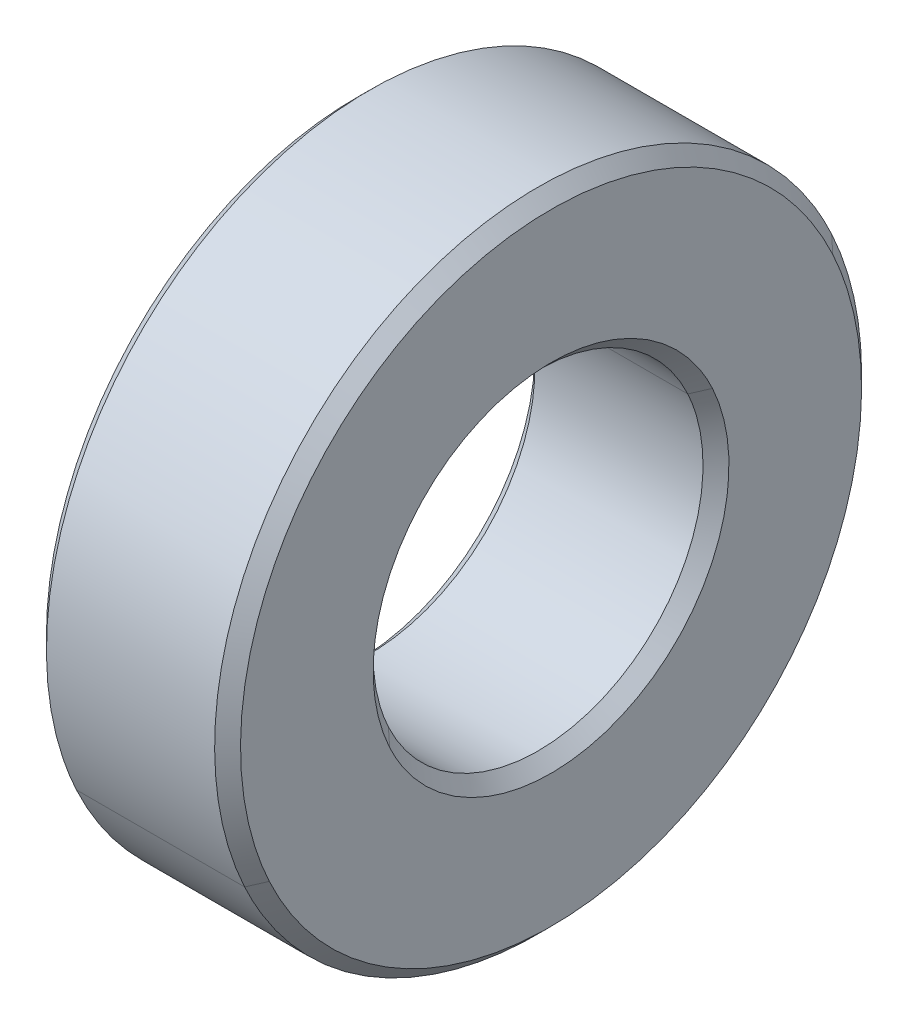
ISO-10303-21;
HEADER;
FILE_DESCRIPTION(('STEP AP214'),'2;1');
FILE_NAME('part.step','',(''),(''),'','','');
FILE_SCHEMA(('AUTOMOTIVE_DESIGN { 1 0 10303 214 1 1 1 1 }'));
ENDSEC;
DATA;
#1=APPLICATION_CONTEXT('core data for automotive mechanical design processes');
#2=APPLICATION_PROTOCOL_DEFINITION('international standard','automotive_design',2000,#1);
#3=PRODUCT_CONTEXT('',#1,'mechanical');
#4=PRODUCT('Part','Part','',(#3));
#5=PRODUCT_RELATED_PRODUCT_CATEGORY('part','',(#4));
#6=PRODUCT_DEFINITION_FORMATION('','',#4);
#7=PRODUCT_DEFINITION_CONTEXT('part definition',#1,'design');
#8=PRODUCT_DEFINITION('design','',#6,#7);
#9=PRODUCT_DEFINITION_SHAPE('','',#8);
#10=(LENGTH_UNIT() NAMED_UNIT(*) SI_UNIT(.MILLI.,.METRE.));
#11=(NAMED_UNIT(*) PLANE_ANGLE_UNIT() SI_UNIT($,.RADIAN.));
#12=(NAMED_UNIT(*) SI_UNIT($,.STERADIAN.) SOLID_ANGLE_UNIT());
#13=UNCERTAINTY_MEASURE_WITH_UNIT(LENGTH_MEASURE(1.E-05),#10,'distance_accuracy_value','');
#14=(GEOMETRIC_REPRESENTATION_CONTEXT(3) GLOBAL_UNCERTAINTY_ASSIGNED_CONTEXT((#13)) GLOBAL_UNIT_ASSIGNED_CONTEXT((#10,
#11,#12)) REPRESENTATION_CONTEXT('',''));
#15=CARTESIAN_POINT('',(0.,0.,0.));
#16=DIRECTION('',(0.,0.,1.));
#17=DIRECTION('',(1.,0.,0.));
#18=AXIS2_PLACEMENT_3D('',#15,#16,#17);
#19=CARTESIAN_POINT('',(179.365281719252,-135.419588338646,254.236344584318));
#20=CARTESIAN_POINT('',(179.565281719252,-135.503685232968,254.417804531319));
#21=CARTESIAN_POINT('',(179.365281719252,-139.774627066664,252.218019120607));
#22=CARTESIAN_POINT('',(179.565281719252,-140.040183907986,252.315382173286));
#23=CARTESIAN_POINT('',(179.365281719252,-137.756301602952,247.862980392589));
#24=CARTESIAN_POINT('',(179.565281719252,-137.937761549952,247.778883498268));
#25=CARTESIAN_POINT('',(179.365281719252,-135.73797613924,243.507941664572));
#26=CARTESIAN_POINT('',(179.565281719252,-135.835339191919,243.242384823249));
#27=CARTESIAN_POINT('',(179.365281719252,-131.382937411222,245.526267128284));
#28=CARTESIAN_POINT('',(179.565281719252,-131.298840516901,245.344807181283));
#29=(BOUNDED_SURFACE() B_SPLINE_SURFACE(2,1,((#19,#20),(#21,#22),(#23,#24),(#25,#26),(#27,#28)),
.UNSPECIFIED.,.F.,.F.,.F.) B_SPLINE_SURFACE_WITH_KNOTS((3,2,3),(2,2),(1.57079632679488,
3.14159265358979,4.71238898038471),(0.,0.282842712474616),
.UNSPECIFIED.) GEOMETRIC_REPRESENTATION_ITEM() RATIONAL_B_SPLINE_SURFACE(((1.,1.),
(0.707106781186541,0.707106781186541),(1.,1.),(0.707106781186541,0.707106781186541),(1.,1.))) REPRESENTATION_ITEM('') SURFACE());
#30=CARTESIAN_POINT('',(179.365281719252,-131.382937411222,245.526267128284));
#31=CARTESIAN_POINT('',(179.565281719252,-131.298840516901,245.344807181283));
#32=(BOUNDED_CURVE() B_SPLINE_CURVE(1,(#30,#31),.UNSPECIFIED.,.F.,
.F.) B_SPLINE_CURVE_WITH_KNOTS((2,2),(0.,0.282842712474606),
.UNSPECIFIED.) CURVE() GEOMETRIC_REPRESENTATION_ITEM() RATIONAL_B_SPLINE_CURVE((1.,1.)) REPRESENTATION_ITEM(''));
#33=CARTESIAN_POINT('',(179.365281719252,-131.382937411222,245.526267128284));
#34=VERTEX_POINT('',#33);
#35=CARTESIAN_POINT('',(179.565281719252,-131.298840516901,245.344807181283));
#36=VERTEX_POINT('',#35);
#37=EDGE_CURVE('E291',#34,#36,#32,.T.);
#38=CARTESIAN_POINT('',(179.565281719252,-135.503685232968,254.417804531319));
#39=CARTESIAN_POINT('',(179.565281719252,-140.040183907986,252.315382173286));
#40=CARTESIAN_POINT('',(179.565281719252,-137.937761549952,247.778883498268));
#41=CARTESIAN_POINT('',(179.565281719252,-135.835339191919,243.24238482325));
#42=CARTESIAN_POINT('',(179.565281719252,-131.298840516901,245.344807181283));
#43=(BOUNDED_CURVE() B_SPLINE_CURVE(2,(#38,#39,#40,#41,#42),.UNSPECIFIED.,.F.,
.F.) B_SPLINE_CURVE_WITH_KNOTS((3,2,3),(0.,7.85398163397448,15.707963267949),
.UNSPECIFIED.) CURVE() GEOMETRIC_REPRESENTATION_ITEM() RATIONAL_B_SPLINE_CURVE((1.,
0.707106781186548,1.,0.707106781186548,1.)) REPRESENTATION_ITEM(''));
#44=CARTESIAN_POINT('',(179.565281719252,-135.503685232968,254.417804531319));
#45=VERTEX_POINT('',#44);
#46=EDGE_CURVE('E132',#45,#36,#43,.T.);
#47=CARTESIAN_POINT('',(179.365281719252,-135.419588338646,254.236344584318));
#48=CARTESIAN_POINT('',(179.565281719252,-135.503685232968,254.417804531319));
#49=(BOUNDED_CURVE() B_SPLINE_CURVE(1,(#47,#48),.UNSPECIFIED.,.F.,
.F.) B_SPLINE_CURVE_WITH_KNOTS((2,2),(0.,0.282842712474606),
.UNSPECIFIED.) CURVE() GEOMETRIC_REPRESENTATION_ITEM() RATIONAL_B_SPLINE_CURVE((1.,1.)) REPRESENTATION_ITEM(''));
#50=CARTESIAN_POINT('',(179.365281719252,-135.419588338646,254.236344584318));
#51=VERTEX_POINT('',#50);
#52=EDGE_CURVE('E133',#51,#45,#49,.T.);
#53=CARTESIAN_POINT('',(179.365281719252,-131.382937411222,245.526267128284));
#54=CARTESIAN_POINT('',(179.365281719252,-135.73797613924,243.507941664572));
#55=CARTESIAN_POINT('',(179.365281719252,-137.756301602952,247.862980392589));
#56=CARTESIAN_POINT('',(179.365281719252,-139.774627066664,252.218019120606));
#57=CARTESIAN_POINT('',(179.365281719252,-135.419588338646,254.236344584318));
#58=(BOUNDED_CURVE() B_SPLINE_CURVE(2,(#53,#54,#55,#56,#57),.UNSPECIFIED.,.F.,
.F.) B_SPLINE_CURVE_WITH_KNOTS((3,2,3),(0.,7.53982236861551,15.079644737231),
.UNSPECIFIED.) CURVE() GEOMETRIC_REPRESENTATION_ITEM() RATIONAL_B_SPLINE_CURVE((1.,
0.707106781186548,1.,0.707106781186548,1.)) REPRESENTATION_ITEM(''));
#59=EDGE_CURVE('E389',#34,#51,#58,.T.);
#60=ORIENTED_EDGE('',*,*,#37,.T.);
#61=ORIENTED_EDGE('',*,*,#46,.F.);
#62=ORIENTED_EDGE('',*,*,#52,.F.);
#63=ORIENTED_EDGE('',*,*,#59,.F.);
#64=EDGE_LOOP('',(#60,#61,#62,#63));
#65=FACE_BOUND('',#64,.T.);
#66=ADVANCED_FACE('F51',(#65),#29,.T.);
#67=CARTESIAN_POINT('',(179.565281719252,-132.329027472337,247.567691532042));
#68=CARTESIAN_POINT('',(179.565281719252,-134.642641796597,246.495456129445));
#69=CARTESIAN_POINT('',(179.565281719252,-135.714877199194,248.809070453704));
#70=CARTESIAN_POINT('',(179.565281719252,-136.787112601791,251.122684777963));
#71=CARTESIAN_POINT('',(179.565281719252,-134.473498277531,252.19492018056));
#72=CARTESIAN_POINT('',(179.365281719252,-132.244930578016,247.386231585041));
#73=CARTESIAN_POINT('',(179.365281719252,-134.740004849276,246.229899288123));
#74=CARTESIAN_POINT('',(179.365281719252,-135.896337146194,248.724973559383));
#75=CARTESIAN_POINT('',(179.365281719252,-137.052669443113,251.220047830643));
#76=CARTESIAN_POINT('',(179.365281719252,-134.557595171853,252.376380127561));
#77=(BOUNDED_SURFACE() B_SPLINE_SURFACE(1,2,((#67,#68,#69,#70,#71),(#72,#73,#74,#75,#76)),
.UNSPECIFIED.,.F.,.F.,.F.) B_SPLINE_SURFACE_WITH_KNOTS((2,2),(3,2,3),(0.,0.282842712474617),
(1.5707963267949,3.14159265358979,4.71238898038469),
.UNSPECIFIED.) GEOMETRIC_REPRESENTATION_ITEM() RATIONAL_B_SPLINE_SURFACE(((1.,0.707106781186548,
1.,0.707106781186548,1.),(1.,0.707106781186548,1.,0.707106781186548,1.))) REPRESENTATION_ITEM('') SURFACE());
#78=CARTESIAN_POINT('',(179.565281719252,-134.473498277531,252.19492018056));
#79=CARTESIAN_POINT('',(179.365281719252,-134.557595171853,252.376380127561));
#80=(BOUNDED_CURVE() B_SPLINE_CURVE(1,(#78,#79),.UNSPECIFIED.,.F.,
.F.) B_SPLINE_CURVE_WITH_KNOTS((2,2),(0.,0.282842712474606),
.UNSPECIFIED.) CURVE() GEOMETRIC_REPRESENTATION_ITEM() RATIONAL_B_SPLINE_CURVE((1.,1.)) REPRESENTATION_ITEM(''));
#81=CARTESIAN_POINT('',(179.565281719252,-134.473498277531,252.19492018056));
#82=VERTEX_POINT('',#81);
#83=CARTESIAN_POINT('',(179.365281719252,-134.557595171853,252.376380127561));
#84=VERTEX_POINT('',#83);
#85=EDGE_CURVE('E217',#82,#84,#80,.T.);
#86=CARTESIAN_POINT('',(179.565281719252,-132.329027472337,247.567691532042));
#87=CARTESIAN_POINT('',(179.565281719252,-134.642641796597,246.495456129445));
#88=CARTESIAN_POINT('',(179.565281719252,-135.714877199194,248.809070453704));
#89=CARTESIAN_POINT('',(179.565281719252,-136.787112601791,251.122684777963));
#90=CARTESIAN_POINT('',(179.565281719252,-134.473498277531,252.19492018056));
#91=(BOUNDED_CURVE() B_SPLINE_CURVE(2,(#86,#87,#88,#89,#90),.UNSPECIFIED.,.F.,
.F.) B_SPLINE_CURVE_WITH_KNOTS((3,2,3),(0.,4.00553063332698,8.01106126665397),
.UNSPECIFIED.) CURVE() GEOMETRIC_REPRESENTATION_ITEM() RATIONAL_B_SPLINE_CURVE((1.,
0.707106781186548,1.,0.707106781186548,1.)) REPRESENTATION_ITEM(''));
#92=CARTESIAN_POINT('',(179.565281719252,-132.329027472337,247.567691532042));
#93=VERTEX_POINT('',#92);
#94=EDGE_CURVE('E65',#93,#82,#91,.T.);
#95=CARTESIAN_POINT('',(179.565281719252,-132.329027472337,247.567691532042));
#96=CARTESIAN_POINT('',(179.365281719252,-132.244930578016,247.386231585041));
#97=(BOUNDED_CURVE() B_SPLINE_CURVE(1,(#95,#96),.UNSPECIFIED.,.F.,
.F.) B_SPLINE_CURVE_WITH_KNOTS((2,2),(0.,0.282842712474606),
.UNSPECIFIED.) CURVE() GEOMETRIC_REPRESENTATION_ITEM() RATIONAL_B_SPLINE_CURVE((1.,1.)) REPRESENTATION_ITEM(''));
#98=CARTESIAN_POINT('',(179.365281719252,-132.244930578016,247.386231585041));
#99=VERTEX_POINT('',#98);
#100=EDGE_CURVE('E283',#93,#99,#97,.T.);
#101=CARTESIAN_POINT('',(179.365281719252,-134.557595171853,252.376380127561));
#102=CARTESIAN_POINT('',(179.365281719252,-137.052669443113,251.220047830643));
#103=CARTESIAN_POINT('',(179.365281719252,-135.896337146194,248.724973559383));
#104=CARTESIAN_POINT('',(179.365281719252,-134.740004849276,246.229899288123));
#105=CARTESIAN_POINT('',(179.365281719252,-132.244930578016,247.386231585041));
#106=(BOUNDED_CURVE() B_SPLINE_CURVE(2,(#101,#102,#103,#104,#105),.UNSPECIFIED.,.F.,
.F.) B_SPLINE_CURVE_WITH_KNOTS((3,2,3),(0.,4.31968989868596,8.63937979737192),
.UNSPECIFIED.) CURVE() GEOMETRIC_REPRESENTATION_ITEM() RATIONAL_B_SPLINE_CURVE((1.,
0.707106781186548,1.,0.707106781186548,1.)) REPRESENTATION_ITEM(''));
#107=EDGE_CURVE('E184',#84,#99,#106,.T.);
#108=ORIENTED_EDGE('',*,*,#85,.F.);
#109=ORIENTED_EDGE('',*,*,#94,.F.);
#110=ORIENTED_EDGE('',*,*,#100,.T.);
#111=ORIENTED_EDGE('',*,*,#107,.F.);
#112=EDGE_LOOP('',(#108,#109,#110,#111));
#113=FACE_BOUND('',#112,.T.);
#114=ADVANCED_FACE('F53',(#113),#77,.T.);
#115=CARTESIAN_POINT('',(182.165281719252,-134.473498277531,252.19492018056));
#116=CARTESIAN_POINT('',(182.165281719252,-136.787112601791,251.122684777963));
#117=CARTESIAN_POINT('',(182.165281719252,-135.714877199194,248.809070453704));
#118=CARTESIAN_POINT('',(182.165281719252,-134.642641796597,246.495456129445));
#119=CARTESIAN_POINT('',(182.165281719252,-132.329027472337,247.567691532042));
#120=CARTESIAN_POINT('',(182.365281719252,-134.557595171853,252.376380127561));
#121=CARTESIAN_POINT('',(182.365281719252,-137.052669443113,251.220047830643));
#122=CARTESIAN_POINT('',(182.365281719252,-135.896337146194,248.724973559383));
#123=CARTESIAN_POINT('',(182.365281719252,-134.740004849276,246.229899288123));
#124=CARTESIAN_POINT('',(182.365281719252,-132.244930578016,247.386231585041));
#125=(BOUNDED_SURFACE() B_SPLINE_SURFACE(1,2,((#115,#116,#117,#118,#119),(#120,#121,#122,#123,
#124)),.UNSPECIFIED.,.F.,.F.,.F.) B_SPLINE_SURFACE_WITH_KNOTS((2,2),(3,2,3),(-0.282842712474619,
0.),(1.57079632679488,3.14159265358979,4.71238898038471),
.UNSPECIFIED.) GEOMETRIC_REPRESENTATION_ITEM() RATIONAL_B_SPLINE_SURFACE(((1.,0.707106781186541,
1.,0.707106781186541,1.),(1.,0.707106781186541,1.,0.707106781186541,1.))) REPRESENTATION_ITEM('') SURFACE());
#126=CARTESIAN_POINT('',(182.165281719252,-132.329027472337,247.567691532042));
#127=CARTESIAN_POINT('',(182.365281719252,-132.244930578016,247.386231585041));
#128=(BOUNDED_CURVE() B_SPLINE_CURVE(1,(#126,#127),.UNSPECIFIED.,.F.,
.F.) B_SPLINE_CURVE_WITH_KNOTS((2,2),(0.,0.282842712474606),
.UNSPECIFIED.) CURVE() GEOMETRIC_REPRESENTATION_ITEM() RATIONAL_B_SPLINE_CURVE((1.,1.)) REPRESENTATION_ITEM(''));
#129=CARTESIAN_POINT('',(182.165281719252,-132.329027472337,247.567691532042));
#130=VERTEX_POINT('',#129);
#131=CARTESIAN_POINT('',(182.365281719252,-132.244930578016,247.386231585041));
#132=VERTEX_POINT('',#131);
#133=EDGE_CURVE('E144',#130,#132,#128,.T.);
#134=CARTESIAN_POINT('',(182.165281719252,-134.473498277531,252.19492018056));
#135=CARTESIAN_POINT('',(182.165281719252,-136.787112601791,251.122684777963));
#136=CARTESIAN_POINT('',(182.165281719252,-135.714877199194,248.809070453704));
#137=CARTESIAN_POINT('',(182.165281719252,-134.642641796597,246.495456129445));
#138=CARTESIAN_POINT('',(182.165281719252,-132.329027472337,247.567691532042));
#139=(BOUNDED_CURVE() B_SPLINE_CURVE(2,(#134,#135,#136,#137,#138),.UNSPECIFIED.,.F.,
.F.) B_SPLINE_CURVE_WITH_KNOTS((3,2,3),(0.,4.00553063332698,8.01106126665397),
.UNSPECIFIED.) CURVE() GEOMETRIC_REPRESENTATION_ITEM() RATIONAL_B_SPLINE_CURVE((1.,
0.707106781186548,1.,0.707106781186548,1.)) REPRESENTATION_ITEM(''));
#140=CARTESIAN_POINT('',(182.165281719252,-134.473498277531,252.19492018056));
#141=VERTEX_POINT('',#140);
#142=EDGE_CURVE('E11',#141,#130,#139,.T.);
#143=CARTESIAN_POINT('',(182.165281719252,-134.473498277531,252.19492018056));
#144=CARTESIAN_POINT('',(182.365281719252,-134.557595171853,252.376380127561));
#145=(BOUNDED_CURVE() B_SPLINE_CURVE(1,(#143,#144),.UNSPECIFIED.,.F.,
.F.) B_SPLINE_CURVE_WITH_KNOTS((2,2),(0.,0.282842712474606),
.UNSPECIFIED.) CURVE() GEOMETRIC_REPRESENTATION_ITEM() RATIONAL_B_SPLINE_CURVE((1.,1.)) REPRESENTATION_ITEM(''));
#146=CARTESIAN_POINT('',(182.365281719252,-134.557595171853,252.376380127561));
#147=VERTEX_POINT('',#146);
#148=EDGE_CURVE('E209',#141,#147,#145,.T.);
#149=CARTESIAN_POINT('',(182.365281719252,-132.244930578016,247.386231585041));
#150=CARTESIAN_POINT('',(182.365281719252,-134.740004849276,246.229899288123));
#151=CARTESIAN_POINT('',(182.365281719252,-135.896337146194,248.724973559383));
#152=CARTESIAN_POINT('',(182.365281719252,-137.052669443113,251.220047830643));
#153=CARTESIAN_POINT('',(182.365281719252,-134.557595171853,252.376380127561));
#154=(BOUNDED_CURVE() B_SPLINE_CURVE(2,(#149,#150,#151,#152,#153),.UNSPECIFIED.,.F.,
.F.) B_SPLINE_CURVE_WITH_KNOTS((3,2,3),(0.,4.31968989868596,8.63937979737191),
.UNSPECIFIED.) CURVE() GEOMETRIC_REPRESENTATION_ITEM() RATIONAL_B_SPLINE_CURVE((1.,
0.707106781186548,1.,0.707106781186548,1.)) REPRESENTATION_ITEM(''));
#155=EDGE_CURVE('E167',#132,#147,#154,.T.);
#156=ORIENTED_EDGE('',*,*,#133,.F.);
#157=ORIENTED_EDGE('',*,*,#142,.F.);
#158=ORIENTED_EDGE('',*,*,#148,.T.);
#159=ORIENTED_EDGE('',*,*,#155,.F.);
#160=EDGE_LOOP('',(#156,#157,#158,#159));
#161=FACE_BOUND('',#160,.T.);
#162=ADVANCED_FACE('F432',(#161),#125,.T.);
#163=CARTESIAN_POINT('',(182.365281719252,-131.382937411222,245.526267128284));
#164=CARTESIAN_POINT('',(182.165281719252,-131.298840516901,245.344807181283));
#165=CARTESIAN_POINT('',(182.365281719252,-135.73797613924,243.507941664572));
#166=CARTESIAN_POINT('',(182.165281719252,-135.835339191919,243.24238482325));
#167=CARTESIAN_POINT('',(182.365281719252,-137.756301602952,247.862980392589));
#168=CARTESIAN_POINT('',(182.165281719252,-137.937761549952,247.778883498268));
#169=CARTESIAN_POINT('',(182.365281719252,-139.774627066664,252.218019120606));
#170=CARTESIAN_POINT('',(182.165281719252,-140.040183907986,252.315382173286));
#171=CARTESIAN_POINT('',(182.365281719252,-135.419588338646,254.236344584318));
#172=CARTESIAN_POINT('',(182.165281719252,-135.503685232968,254.417804531319));
#173=(BOUNDED_SURFACE() B_SPLINE_SURFACE(2,1,((#163,#164),(#165,#166),(#167,#168),(#169,#170),
(#171,#172)),.UNSPECIFIED.,.F.,.F.,.F.) B_SPLINE_SURFACE_WITH_KNOTS((3,2,3),(2,2),
(1.5707963267949,3.14159265358979,4.71238898038469),(-0.282842712474618,0.),
.UNSPECIFIED.) GEOMETRIC_REPRESENTATION_ITEM() RATIONAL_B_SPLINE_SURFACE(((1.,1.),
(0.707106781186548,0.707106781186548),(1.,1.),(0.707106781186548,0.707106781186548),(1.,1.))) REPRESENTATION_ITEM('') SURFACE());
#174=CARTESIAN_POINT('',(182.365281719252,-135.419588338646,254.236344584318));
#175=CARTESIAN_POINT('',(182.165281719252,-135.503685232968,254.417804531319));
#176=(BOUNDED_CURVE() B_SPLINE_CURVE(1,(#174,#175),.UNSPECIFIED.,.F.,
.F.) B_SPLINE_CURVE_WITH_KNOTS((2,2),(0.,0.282842712474606),
.UNSPECIFIED.) CURVE() GEOMETRIC_REPRESENTATION_ITEM() RATIONAL_B_SPLINE_CURVE((1.,1.)) REPRESENTATION_ITEM(''));
#177=CARTESIAN_POINT('',(182.365281719252,-135.419588338646,254.236344584318));
#178=VERTEX_POINT('',#177);
#179=CARTESIAN_POINT('',(182.165281719252,-135.503685232968,254.417804531319));
#180=VERTEX_POINT('',#179);
#181=EDGE_CURVE('E129',#178,#180,#176,.T.);
#182=CARTESIAN_POINT('',(182.165281719252,-131.298840516901,245.344807181283));
#183=CARTESIAN_POINT('',(182.165281719252,-135.835339191919,243.24238482325));
#184=CARTESIAN_POINT('',(182.165281719252,-137.937761549952,247.778883498268));
#185=CARTESIAN_POINT('',(182.165281719252,-140.040183907986,252.315382173286));
#186=CARTESIAN_POINT('',(182.165281719252,-135.503685232968,254.417804531319));
#187=(BOUNDED_CURVE() B_SPLINE_CURVE(2,(#182,#183,#184,#185,#186),.UNSPECIFIED.,.F.,
.F.) B_SPLINE_CURVE_WITH_KNOTS((3,2,3),(0.,7.85398163397448,15.707963267949),
.UNSPECIFIED.) CURVE() GEOMETRIC_REPRESENTATION_ITEM() RATIONAL_B_SPLINE_CURVE((1.,
0.707106781186548,1.,0.707106781186548,1.)) REPRESENTATION_ITEM(''));
#188=CARTESIAN_POINT('',(182.165281719252,-131.298840516901,245.344807181283));
#189=VERTEX_POINT('',#188);
#190=EDGE_CURVE('E101',#189,#180,#187,.T.);
#191=CARTESIAN_POINT('',(182.365281719252,-131.382937411222,245.526267128284));
#192=CARTESIAN_POINT('',(182.165281719252,-131.298840516901,245.344807181283));
#193=(BOUNDED_CURVE() B_SPLINE_CURVE(1,(#191,#192),.UNSPECIFIED.,.F.,
.F.) B_SPLINE_CURVE_WITH_KNOTS((2,2),(0.,0.282842712474606),
.UNSPECIFIED.) CURVE() GEOMETRIC_REPRESENTATION_ITEM() RATIONAL_B_SPLINE_CURVE((1.,1.)) REPRESENTATION_ITEM(''));
#194=CARTESIAN_POINT('',(182.365281719252,-131.382937411222,245.526267128284));
#195=VERTEX_POINT('',#194);
#196=EDGE_CURVE('E127',#195,#189,#193,.T.);
#197=CARTESIAN_POINT('',(182.365281719252,-135.419588338646,254.236344584318));
#198=CARTESIAN_POINT('',(182.365281719252,-139.774627066664,252.218019120606));
#199=CARTESIAN_POINT('',(182.365281719252,-137.756301602952,247.862980392589));
#200=CARTESIAN_POINT('',(182.365281719252,-135.73797613924,243.507941664572));
#201=CARTESIAN_POINT('',(182.365281719252,-131.382937411222,245.526267128284));
#202=(BOUNDED_CURVE() B_SPLINE_CURVE(2,(#197,#198,#199,#200,#201),.UNSPECIFIED.,.F.,
.F.) B_SPLINE_CURVE_WITH_KNOTS((3,2,3),(0.,7.53982236861551,15.079644737231),
.UNSPECIFIED.) CURVE() GEOMETRIC_REPRESENTATION_ITEM() RATIONAL_B_SPLINE_CURVE((1.,
0.707106781186547,1.,0.707106781186547,1.)) REPRESENTATION_ITEM(''));
#203=EDGE_CURVE('E201',#178,#195,#202,.T.);
#204=ORIENTED_EDGE('',*,*,#181,.T.);
#205=ORIENTED_EDGE('',*,*,#190,.F.);
#206=ORIENTED_EDGE('',*,*,#196,.F.);
#207=ORIENTED_EDGE('',*,*,#203,.F.);
#208=EDGE_LOOP('',(#204,#205,#206,#207));
#209=FACE_BOUND('',#208,.T.);
#210=ADVANCED_FACE('F125',(#209),#173,.T.);
#211=CARTESIAN_POINT('',(179.565281719252,-134.473498277531,252.19492018056));
#212=CARTESIAN_POINT('',(179.565281719252,-136.787112601791,251.122684777963));
#213=CARTESIAN_POINT('',(179.565281719252,-135.714877199194,248.809070453704));
#214=CARTESIAN_POINT('',(179.565281719252,-134.642641796597,246.495456129445));
#215=CARTESIAN_POINT('',(179.565281719252,-132.329027472337,247.567691532042));
#216=CARTESIAN_POINT('',(182.165281719252,-134.473498277531,252.19492018056));
#217=CARTESIAN_POINT('',(182.165281719252,-136.787112601791,251.122684777963));
#218=CARTESIAN_POINT('',(182.165281719252,-135.714877199194,248.809070453704));
#219=CARTESIAN_POINT('',(182.165281719252,-134.642641796597,246.495456129445));
#220=CARTESIAN_POINT('',(182.165281719252,-132.329027472337,247.567691532042));
#221=(BOUNDED_SURFACE() B_SPLINE_SURFACE(1,2,((#211,#212,#213,#214,#215),(#216,#217,#218,#219,
#220)),.UNSPECIFIED.,.F.,.F.,.F.) B_SPLINE_SURFACE_WITH_KNOTS((2,2),(3,2,3),(0.2,2.8),
(1.5707963267949,3.14159265358979,4.71238898038469),
.UNSPECIFIED.) GEOMETRIC_REPRESENTATION_ITEM() RATIONAL_B_SPLINE_SURFACE(((1.,0.707106781186548,
1.,0.707106781186548,1.),(1.,0.707106781186548,1.,0.707106781186548,1.))) REPRESENTATION_ITEM('') SURFACE());
#222=CARTESIAN_POINT('',(179.565281719252,-132.329027472337,247.567691532042));
#223=CARTESIAN_POINT('',(182.165281719252,-132.329027472337,247.567691532042));
#224=(BOUNDED_CURVE() B_SPLINE_CURVE(1,(#222,#223),.UNSPECIFIED.,.F.,
.F.) B_SPLINE_CURVE_WITH_KNOTS((2,2),(0.,2.6),
.UNSPECIFIED.) CURVE() GEOMETRIC_REPRESENTATION_ITEM() RATIONAL_B_SPLINE_CURVE((1.,1.)) REPRESENTATION_ITEM(''));
#225=EDGE_CURVE('E153',#93,#130,#224,.T.);
#226=CARTESIAN_POINT('',(179.565281719252,-134.473498277531,252.19492018056));
#227=CARTESIAN_POINT('',(182.165281719252,-134.473498277531,252.19492018056));
#228=(BOUNDED_CURVE() B_SPLINE_CURVE(1,(#226,#227),.UNSPECIFIED.,.F.,
.F.) B_SPLINE_CURVE_WITH_KNOTS((2,2),(0.,2.6),
.UNSPECIFIED.) CURVE() GEOMETRIC_REPRESENTATION_ITEM() RATIONAL_B_SPLINE_CURVE((1.,1.)) REPRESENTATION_ITEM(''));
#229=EDGE_CURVE('E246',#82,#141,#228,.T.);
#230=ORIENTED_EDGE('',*,*,#225,.F.);
#231=ORIENTED_EDGE('',*,*,#94,.T.);
#232=ORIENTED_EDGE('',*,*,#229,.T.);
#233=ORIENTED_EDGE('',*,*,#142,.T.);
#234=EDGE_LOOP('',(#230,#231,#232,#233));
#235=FACE_BOUND('',#234,.T.);
#236=ADVANCED_FACE('F478',(#235),#221,.T.);
#237=CARTESIAN_POINT('',(179.565281719252,-135.503685232968,254.417804531319));
#238=CARTESIAN_POINT('',(182.165281719252,-135.503685232968,254.417804531319));
#239=CARTESIAN_POINT('',(179.565281719252,-140.040183907986,252.315382173286));
#240=CARTESIAN_POINT('',(182.165281719252,-140.040183907986,252.315382173286));
#241=CARTESIAN_POINT('',(179.565281719252,-137.937761549952,247.778883498268));
#242=CARTESIAN_POINT('',(182.165281719252,-137.937761549952,247.778883498268));
#243=CARTESIAN_POINT('',(179.565281719252,-135.835339191919,243.24238482325));
#244=CARTESIAN_POINT('',(182.165281719252,-135.835339191919,243.24238482325));
#245=CARTESIAN_POINT('',(179.565281719252,-131.298840516901,245.344807181283));
#246=CARTESIAN_POINT('',(182.165281719252,-131.298840516901,245.344807181283));
#247=(BOUNDED_SURFACE() B_SPLINE_SURFACE(2,1,((#237,#238),(#239,#240),(#241,#242),(#243,#244),
(#245,#246)),.UNSPECIFIED.,.F.,.F.,.F.) B_SPLINE_SURFACE_WITH_KNOTS((3,2,3),(2,2),
(1.5707963267949,3.14159265358979,4.71238898038469),(0.2,2.8),
.UNSPECIFIED.) GEOMETRIC_REPRESENTATION_ITEM() RATIONAL_B_SPLINE_SURFACE(((1.,1.),
(0.707106781186548,0.707106781186548),(1.,1.),(0.707106781186548,0.707106781186548),(1.,1.))) REPRESENTATION_ITEM('') SURFACE());
#248=CARTESIAN_POINT('',(179.565281719252,-131.298840516901,245.344807181283));
#249=CARTESIAN_POINT('',(182.165281719252,-131.298840516901,245.344807181283));
#250=(BOUNDED_CURVE() B_SPLINE_CURVE(1,(#248,#249),.UNSPECIFIED.,.F.,
.F.) B_SPLINE_CURVE_WITH_KNOTS((2,2),(0.,2.6),
.UNSPECIFIED.) CURVE() GEOMETRIC_REPRESENTATION_ITEM() RATIONAL_B_SPLINE_CURVE((1.,1.)) REPRESENTATION_ITEM(''));
#251=EDGE_CURVE('E150',#36,#189,#250,.T.);
#252=CARTESIAN_POINT('',(179.565281719252,-135.503685232968,254.417804531319));
#253=CARTESIAN_POINT('',(182.165281719252,-135.503685232968,254.417804531319));
#254=(BOUNDED_CURVE() B_SPLINE_CURVE(1,(#252,#253),.UNSPECIFIED.,.F.,
.F.) B_SPLINE_CURVE_WITH_KNOTS((2,2),(0.,2.6),
.UNSPECIFIED.) CURVE() GEOMETRIC_REPRESENTATION_ITEM() RATIONAL_B_SPLINE_CURVE((1.,1.)) REPRESENTATION_ITEM(''));
#255=EDGE_CURVE('E151',#45,#180,#254,.T.);
#256=ORIENTED_EDGE('',*,*,#251,.T.);
#257=ORIENTED_EDGE('',*,*,#190,.T.);
#258=ORIENTED_EDGE('',*,*,#255,.F.);
#259=ORIENTED_EDGE('',*,*,#46,.T.);
#260=EDGE_LOOP('',(#256,#257,#258,#259));
#261=FACE_BOUND('',#260,.T.);
#262=ADVANCED_FACE('F155',(#261),#247,.T.);
#263=CARTESIAN_POINT('',(179.365281719252,-131.382937411222,245.526267128284));
#264=CARTESIAN_POINT('',(179.565281719252,-131.298840516901,245.344807181283));
#265=CARTESIAN_POINT('',(179.365281719252,-127.027898683205,247.544592591995));
#266=CARTESIAN_POINT('',(179.565281719252,-126.762341841883,247.447229539316));
#267=CARTESIAN_POINT('',(179.365281719252,-129.046224146917,251.899631320013));
#268=CARTESIAN_POINT('',(179.565281719252,-128.864764199916,251.983728214334));
#269=CARTESIAN_POINT('',(179.365281719252,-131.064549610629,256.254670048031));
#270=CARTESIAN_POINT('',(179.565281719252,-130.967186557949,256.520226889353));
#271=CARTESIAN_POINT('',(179.365281719252,-135.419588338646,254.236344584318));
#272=CARTESIAN_POINT('',(179.565281719252,-135.503685232968,254.417804531319));
#273=(BOUNDED_SURFACE() B_SPLINE_SURFACE(2,1,((#263,#264),(#265,#266),(#267,#268),(#269,#270),
(#271,#272)),.UNSPECIFIED.,.F.,.F.,.F.) B_SPLINE_SURFACE_WITH_KNOTS((3,2,3),(2,2),
(1.57079632679489,3.14159265358979,4.7123889803847),(0.,0.282842712474616),
.UNSPECIFIED.) GEOMETRIC_REPRESENTATION_ITEM() RATIONAL_B_SPLINE_SURFACE(((1.,1.),
(0.707106781186544,0.707106781186544),(1.,1.),(0.707106781186544,0.707106781186544),(1.,1.))) REPRESENTATION_ITEM('') SURFACE());
#274=CARTESIAN_POINT('',(179.365281719252,-135.419588338646,254.236344584318));
#275=CARTESIAN_POINT('',(179.365281719252,-131.064549610629,256.25467004803));
#276=CARTESIAN_POINT('',(179.365281719252,-129.046224146917,251.899631320013));
#277=CARTESIAN_POINT('',(179.365281719252,-127.027898683205,247.544592591995));
#278=CARTESIAN_POINT('',(179.365281719252,-131.382937411222,245.526267128284));
#279=(BOUNDED_CURVE() B_SPLINE_CURVE(2,(#274,#275,#276,#277,#278),.UNSPECIFIED.,.F.,
.F.) B_SPLINE_CURVE_WITH_KNOTS((3,2,3),(0.,7.53982236861551,15.079644737231),
.UNSPECIFIED.) CURVE() GEOMETRIC_REPRESENTATION_ITEM() RATIONAL_B_SPLINE_CURVE((1.,
0.707106781186548,1.,0.707106781186548,1.)) REPRESENTATION_ITEM(''));
#280=EDGE_CURVE('E394',#51,#34,#279,.T.);
#281=CARTESIAN_POINT('',(179.565281719252,-131.298840516901,245.344807181283));
#282=CARTESIAN_POINT('',(179.565281719252,-126.762341841883,247.447229539316));
#283=CARTESIAN_POINT('',(179.565281719252,-128.864764199916,251.983728214334));
#284=CARTESIAN_POINT('',(179.565281719252,-130.967186557949,256.520226889352));
#285=CARTESIAN_POINT('',(179.565281719252,-135.503685232968,254.417804531319));
#286=(BOUNDED_CURVE() B_SPLINE_CURVE(2,(#281,#282,#283,#284,#285),.UNSPECIFIED.,.F.,
.F.) B_SPLINE_CURVE_WITH_KNOTS((3,2,3),(0.,7.85398163397448,15.707963267949),
.UNSPECIFIED.) CURVE() GEOMETRIC_REPRESENTATION_ITEM() RATIONAL_B_SPLINE_CURVE((1.,
0.707106781186548,1.,0.707106781186548,1.)) REPRESENTATION_ITEM(''));
#287=EDGE_CURVE('E158',#36,#45,#286,.T.);
#288=ORIENTED_EDGE('',*,*,#37,.F.);
#289=ORIENTED_EDGE('',*,*,#280,.F.);
#290=ORIENTED_EDGE('',*,*,#52,.T.);
#291=ORIENTED_EDGE('',*,*,#287,.F.);
#292=EDGE_LOOP('',(#288,#289,#290,#291));
#293=FACE_BOUND('',#292,.T.);
#294=ADVANCED_FACE('F468',(#293),#273,.T.);
#295=CARTESIAN_POINT('',(179.565281719252,-134.473498277531,252.19492018056));
#296=CARTESIAN_POINT('',(179.565281719252,-132.159883953272,253.267155583157));
#297=CARTESIAN_POINT('',(179.565281719252,-131.087648550675,250.953541258898));
#298=CARTESIAN_POINT('',(179.565281719252,-130.015413148078,248.639926934639));
#299=CARTESIAN_POINT('',(179.565281719252,-132.329027472337,247.567691532042));
#300=CARTESIAN_POINT('',(179.365281719252,-134.557595171853,252.376380127561));
#301=CARTESIAN_POINT('',(179.365281719252,-132.062520900593,253.532712424479));
#302=CARTESIAN_POINT('',(179.365281719252,-130.906188603674,251.037638153219));
#303=CARTESIAN_POINT('',(179.365281719252,-129.749856306756,248.542563881959));
#304=CARTESIAN_POINT('',(179.365281719252,-132.244930578016,247.386231585041));
#305=(BOUNDED_SURFACE() B_SPLINE_SURFACE(1,2,((#295,#296,#297,#298,#299),(#300,#301,#302,#303,
#304)),.UNSPECIFIED.,.F.,.F.,.F.) B_SPLINE_SURFACE_WITH_KNOTS((2,2),(3,2,3),(0.,
0.282842712474617),(1.57079632679488,3.14159265358979,4.71238898038471),
.UNSPECIFIED.) GEOMETRIC_REPRESENTATION_ITEM() RATIONAL_B_SPLINE_SURFACE(((1.,0.707106781186541,
1.,0.707106781186541,1.),(1.,0.707106781186541,1.,0.707106781186541,1.))) REPRESENTATION_ITEM('') SURFACE());
#306=CARTESIAN_POINT('',(179.365281719252,-132.244930578016,247.386231585041));
#307=CARTESIAN_POINT('',(179.365281719252,-129.749856306756,248.542563881959));
#308=CARTESIAN_POINT('',(179.365281719252,-130.906188603674,251.037638153219));
#309=CARTESIAN_POINT('',(179.365281719252,-132.062520900593,253.532712424479));
#310=CARTESIAN_POINT('',(179.365281719252,-134.557595171853,252.376380127561));
#311=(BOUNDED_CURVE() B_SPLINE_CURVE(2,(#306,#307,#308,#309,#310),.UNSPECIFIED.,.F.,
.F.) B_SPLINE_CURVE_WITH_KNOTS((3,2,3),(0.,4.31968989868597,8.63937979737193),
.UNSPECIFIED.) CURVE() GEOMETRIC_REPRESENTATION_ITEM() RATIONAL_B_SPLINE_CURVE((1.,
0.707106781186548,1.,0.707106781186548,1.)) REPRESENTATION_ITEM(''));
#312=EDGE_CURVE('E193',#99,#84,#311,.T.);
#313=CARTESIAN_POINT('',(179.565281719252,-134.473498277531,252.19492018056));
#314=CARTESIAN_POINT('',(179.565281719252,-132.159883953272,253.267155583157));
#315=CARTESIAN_POINT('',(179.565281719252,-131.087648550675,250.953541258898));
#316=CARTESIAN_POINT('',(179.565281719252,-130.015413148078,248.639926934639));
#317=CARTESIAN_POINT('',(179.565281719252,-132.329027472337,247.567691532042));
#318=(BOUNDED_CURVE() B_SPLINE_CURVE(2,(#313,#314,#315,#316,#317),.UNSPECIFIED.,.F.,
.F.) B_SPLINE_CURVE_WITH_KNOTS((3,2,3),(0.,4.00553063332699,8.01106126665397),
.UNSPECIFIED.) CURVE() GEOMETRIC_REPRESENTATION_ITEM() RATIONAL_B_SPLINE_CURVE((1.,
0.707106781186548,1.,0.707106781186548,1.)) REPRESENTATION_ITEM(''));
#319=EDGE_CURVE('E183',#82,#93,#318,.T.);
#320=ORIENTED_EDGE('',*,*,#85,.T.);
#321=ORIENTED_EDGE('',*,*,#312,.F.);
#322=ORIENTED_EDGE('',*,*,#100,.F.);
#323=ORIENTED_EDGE('',*,*,#319,.F.);
#324=EDGE_LOOP('',(#320,#321,#322,#323));
#325=FACE_BOUND('',#324,.T.);
#326=ADVANCED_FACE('F456',(#325),#305,.T.);
#327=CARTESIAN_POINT('',(182.165281719252,-132.329027472337,247.567691532042));
#328=CARTESIAN_POINT('',(182.165281719252,-130.015413148078,248.639926934639));
#329=CARTESIAN_POINT('',(182.165281719252,-131.087648550675,250.953541258898));
#330=CARTESIAN_POINT('',(182.165281719252,-132.159883953272,253.267155583157));
#331=CARTESIAN_POINT('',(182.165281719252,-134.473498277531,252.19492018056));
#332=CARTESIAN_POINT('',(182.365281719252,-132.244930578016,247.386231585041));
#333=CARTESIAN_POINT('',(182.365281719252,-129.749856306756,248.542563881959));
#334=CARTESIAN_POINT('',(182.365281719252,-130.906188603674,251.037638153219));
#335=CARTESIAN_POINT('',(182.365281719252,-132.062520900593,253.532712424479));
#336=CARTESIAN_POINT('',(182.365281719252,-134.557595171853,252.376380127561));
#337=(BOUNDED_SURFACE() B_SPLINE_SURFACE(1,2,((#327,#328,#329,#330,#331),(#332,#333,#334,#335,
#336)),.UNSPECIFIED.,.F.,.F.,.F.) B_SPLINE_SURFACE_WITH_KNOTS((2,2),(3,2,3),(-0.282842712474619,
0.),(1.57079632679489,3.14159265358979,4.7123889803847),
.UNSPECIFIED.) GEOMETRIC_REPRESENTATION_ITEM() RATIONAL_B_SPLINE_SURFACE(((1.,0.707106781186544,
1.,0.707106781186544,1.),(1.,0.707106781186544,1.,0.707106781186544,1.))) REPRESENTATION_ITEM('') SURFACE());
#338=CARTESIAN_POINT('',(182.365281719252,-134.557595171853,252.376380127561));
#339=CARTESIAN_POINT('',(182.365281719252,-132.062520900593,253.532712424479));
#340=CARTESIAN_POINT('',(182.365281719252,-130.906188603674,251.037638153219));
#341=CARTESIAN_POINT('',(182.365281719252,-129.749856306756,248.542563881959));
#342=CARTESIAN_POINT('',(182.365281719252,-132.244930578016,247.386231585041));
#343=(BOUNDED_CURVE() B_SPLINE_CURVE(2,(#338,#339,#340,#341,#342),.UNSPECIFIED.,.F.,
.F.) B_SPLINE_CURVE_WITH_KNOTS((3,2,3),(0.,4.31968989868596,8.63937979737192),
.UNSPECIFIED.) CURVE() GEOMETRIC_REPRESENTATION_ITEM() RATIONAL_B_SPLINE_CURVE((1.,
0.707106781186548,1.,0.707106781186548,1.)) REPRESENTATION_ITEM(''));
#344=EDGE_CURVE('E159',#147,#132,#343,.T.);
#345=CARTESIAN_POINT('',(182.165281719252,-132.329027472337,247.567691532042));
#346=CARTESIAN_POINT('',(182.165281719252,-130.015413148078,248.639926934639));
#347=CARTESIAN_POINT('',(182.165281719252,-131.087648550675,250.953541258898));
#348=CARTESIAN_POINT('',(182.165281719252,-132.159883953272,253.267155583157));
#349=CARTESIAN_POINT('',(182.165281719252,-134.473498277531,252.19492018056));
#350=(BOUNDED_CURVE() B_SPLINE_CURVE(2,(#345,#346,#347,#348,#349),.UNSPECIFIED.,.F.,
.F.) B_SPLINE_CURVE_WITH_KNOTS((3,2,3),(0.,4.00553063332699,8.01106126665397),
.UNSPECIFIED.) CURVE() GEOMETRIC_REPRESENTATION_ITEM() RATIONAL_B_SPLINE_CURVE((1.,
0.707106781186548,1.,0.707106781186548,1.)) REPRESENTATION_ITEM(''));
#351=EDGE_CURVE('E237',#130,#141,#350,.T.);
#352=ORIENTED_EDGE('',*,*,#133,.T.);
#353=ORIENTED_EDGE('',*,*,#344,.F.);
#354=ORIENTED_EDGE('',*,*,#148,.F.);
#355=ORIENTED_EDGE('',*,*,#351,.F.);
#356=EDGE_LOOP('',(#352,#353,#354,#355));
#357=FACE_BOUND('',#356,.T.);
#358=ADVANCED_FACE('F476',(#357),#337,.T.);
#359=CARTESIAN_POINT('',(182.365281719252,-135.419588338646,254.236344584318));
#360=CARTESIAN_POINT('',(182.165281719252,-135.503685232968,254.417804531319));
#361=CARTESIAN_POINT('',(182.365281719252,-131.064549610629,256.254670048031));
#362=CARTESIAN_POINT('',(182.165281719252,-130.967186557949,256.520226889353));
#363=CARTESIAN_POINT('',(182.365281719252,-129.046224146917,251.899631320013));
#364=CARTESIAN_POINT('',(182.165281719252,-128.864764199916,251.983728214334));
#365=CARTESIAN_POINT('',(182.365281719252,-127.027898683205,247.544592591995));
#366=CARTESIAN_POINT('',(182.165281719252,-126.762341841883,247.447229539316));
#367=CARTESIAN_POINT('',(182.365281719252,-131.382937411222,245.526267128284));
#368=CARTESIAN_POINT('',(182.165281719252,-131.298840516901,245.344807181283));
#369=(BOUNDED_SURFACE() B_SPLINE_SURFACE(2,1,((#359,#360),(#361,#362),(#363,#364),(#365,#366),
(#367,#368)),.UNSPECIFIED.,.F.,.F.,.F.) B_SPLINE_SURFACE_WITH_KNOTS((3,2,3),(2,2),
(1.57079632679488,3.14159265358979,4.71238898038471),(-0.282842712474618,0.),
.UNSPECIFIED.) GEOMETRIC_REPRESENTATION_ITEM() RATIONAL_B_SPLINE_SURFACE(((1.,1.),
(0.707106781186541,0.707106781186541),(1.,1.),(0.707106781186541,0.707106781186541),(1.,1.))) REPRESENTATION_ITEM('') SURFACE());
#370=CARTESIAN_POINT('',(182.365281719252,-131.382937411222,245.526267128284));
#371=CARTESIAN_POINT('',(182.365281719252,-127.027898683205,247.544592591995));
#372=CARTESIAN_POINT('',(182.365281719252,-129.046224146917,251.899631320013));
#373=CARTESIAN_POINT('',(182.365281719252,-131.064549610629,256.25467004803));
#374=CARTESIAN_POINT('',(182.365281719252,-135.419588338646,254.236344584318));
#375=(BOUNDED_CURVE() B_SPLINE_CURVE(2,(#370,#371,#372,#373,#374),.UNSPECIFIED.,.F.,
.F.) B_SPLINE_CURVE_WITH_KNOTS((3,2,3),(0.,7.53982236861551,15.079644737231),
.UNSPECIFIED.) CURVE() GEOMETRIC_REPRESENTATION_ITEM() RATIONAL_B_SPLINE_CURVE((1.,
0.707106781186548,1.,0.707106781186548,1.)) REPRESENTATION_ITEM(''));
#376=EDGE_CURVE('E142',#195,#178,#375,.T.);
#377=CARTESIAN_POINT('',(182.165281719252,-135.503685232968,254.417804531319));
#378=CARTESIAN_POINT('',(182.165281719252,-130.967186557949,256.520226889352));
#379=CARTESIAN_POINT('',(182.165281719252,-128.864764199916,251.983728214334));
#380=CARTESIAN_POINT('',(182.165281719252,-126.762341841883,247.447229539316));
#381=CARTESIAN_POINT('',(182.165281719252,-131.298840516901,245.344807181283));
#382=(BOUNDED_CURVE() B_SPLINE_CURVE(2,(#377,#378,#379,#380,#381),.UNSPECIFIED.,.F.,
.F.) B_SPLINE_CURVE_WITH_KNOTS((3,2,3),(0.,7.85398163397448,15.707963267949),
.UNSPECIFIED.) CURVE() GEOMETRIC_REPRESENTATION_ITEM() RATIONAL_B_SPLINE_CURVE((1.,
0.707106781186548,1.,0.707106781186548,1.)) REPRESENTATION_ITEM(''));
#383=EDGE_CURVE('E139',#180,#189,#382,.T.);
#384=ORIENTED_EDGE('',*,*,#181,.F.);
#385=ORIENTED_EDGE('',*,*,#376,.F.);
#386=ORIENTED_EDGE('',*,*,#196,.T.);
#387=ORIENTED_EDGE('',*,*,#383,.F.);
#388=EDGE_LOOP('',(#384,#385,#386,#387));
#389=FACE_BOUND('',#388,.T.);
#390=ADVANCED_FACE('F138',(#389),#369,.T.);
#391=CARTESIAN_POINT('',(179.565281719252,-132.329027472337,247.567691532042));
#392=CARTESIAN_POINT('',(179.565281719252,-130.015413148078,248.639926934639));
#393=CARTESIAN_POINT('',(179.565281719252,-131.087648550675,250.953541258898));
#394=CARTESIAN_POINT('',(179.565281719252,-132.159883953272,253.267155583157));
#395=CARTESIAN_POINT('',(179.565281719252,-134.473498277531,252.19492018056));
#396=CARTESIAN_POINT('',(182.165281719252,-132.329027472337,247.567691532042));
#397=CARTESIAN_POINT('',(182.165281719252,-130.015413148078,248.639926934639));
#398=CARTESIAN_POINT('',(182.165281719252,-131.087648550675,250.953541258898));
#399=CARTESIAN_POINT('',(182.165281719252,-132.159883953272,253.267155583157));
#400=CARTESIAN_POINT('',(182.165281719252,-134.473498277531,252.19492018056));
#401=(BOUNDED_SURFACE() B_SPLINE_SURFACE(1,2,((#391,#392,#393,#394,#395),(#396,#397,#398,#399,
#400)),.UNSPECIFIED.,.F.,.F.,.F.) B_SPLINE_SURFACE_WITH_KNOTS((2,2),(3,2,3),(0.2,2.8),
(1.5707963267949,3.14159265358979,4.71238898038469),
.UNSPECIFIED.) GEOMETRIC_REPRESENTATION_ITEM() RATIONAL_B_SPLINE_SURFACE(((1.,0.707106781186548,
1.,0.707106781186548,1.),(1.,0.707106781186548,1.,0.707106781186548,1.))) REPRESENTATION_ITEM('') SURFACE());
#402=ORIENTED_EDGE('',*,*,#225,.T.);
#403=ORIENTED_EDGE('',*,*,#351,.T.);
#404=ORIENTED_EDGE('',*,*,#229,.F.);
#405=ORIENTED_EDGE('',*,*,#319,.T.);
#406=EDGE_LOOP('',(#402,#403,#404,#405));
#407=FACE_BOUND('',#406,.T.);
#408=ADVANCED_FACE('F514',(#407),#401,.T.);
#409=CARTESIAN_POINT('',(179.565281719252,-131.298840516901,245.344807181283));
#410=CARTESIAN_POINT('',(182.165281719252,-131.298840516901,245.344807181283));
#411=CARTESIAN_POINT('',(179.565281719252,-126.762341841883,247.447229539316));
#412=CARTESIAN_POINT('',(182.165281719252,-126.762341841883,247.447229539316));
#413=CARTESIAN_POINT('',(179.565281719252,-128.864764199916,251.983728214334));
#414=CARTESIAN_POINT('',(182.165281719252,-128.864764199916,251.983728214334));
#415=CARTESIAN_POINT('',(179.565281719252,-130.967186557949,256.520226889352));
#416=CARTESIAN_POINT('',(182.165281719252,-130.967186557949,256.520226889352));
#417=CARTESIAN_POINT('',(179.565281719252,-135.503685232968,254.417804531319));
#418=CARTESIAN_POINT('',(182.165281719252,-135.503685232968,254.417804531319));
#419=(BOUNDED_SURFACE() B_SPLINE_SURFACE(2,1,((#409,#410),(#411,#412),(#413,#414),(#415,#416),
(#417,#418)),.UNSPECIFIED.,.F.,.F.,.F.) B_SPLINE_SURFACE_WITH_KNOTS((3,2,3),(2,2),
(1.5707963267949,3.14159265358979,4.71238898038469),(0.2,2.8),
.UNSPECIFIED.) GEOMETRIC_REPRESENTATION_ITEM() RATIONAL_B_SPLINE_SURFACE(((1.,1.),
(0.707106781186548,0.707106781186548),(1.,1.),(0.707106781186548,0.707106781186548),(1.,1.))) REPRESENTATION_ITEM('') SURFACE());
#420=ORIENTED_EDGE('',*,*,#251,.F.);
#421=ORIENTED_EDGE('',*,*,#287,.T.);
#422=ORIENTED_EDGE('',*,*,#255,.T.);
#423=ORIENTED_EDGE('',*,*,#383,.T.);
#424=EDGE_LOOP('',(#420,#421,#422,#423));
#425=FACE_BOUND('',#424,.T.);
#426=ADVANCED_FACE('F148',(#425),#419,.T.);
#427=CARTESIAN_POINT('',(182.365281719252,-131.064549610629,256.25467004803));
#428=DIRECTION('',(1.,0.,0.));
#429=DIRECTION('',(0.,1.,0.));
#430=AXIS2_PLACEMENT_3D('',#427,#428,#429);
#431=PLANE('',#430);
#432=ORIENTED_EDGE('',*,*,#155,.T.);
#433=ORIENTED_EDGE('',*,*,#344,.T.);
#434=EDGE_LOOP('',(#432,#433));
#435=FACE_BOUND('',#434,.T.);
#436=ORIENTED_EDGE('',*,*,#376,.T.);
#437=ORIENTED_EDGE('',*,*,#203,.T.);
#438=EDGE_LOOP('',(#436,#437));
#439=FACE_BOUND('',#438,.T.);
#440=ADVANCED_FACE('F425',(#435,#439),#431,.T.);
#441=CARTESIAN_POINT('',(179.365281719252,-131.064549610629,256.25467004803));
#442=DIRECTION('',(-1.,0.,0.));
#443=DIRECTION('',(0.,0.,1.));
#444=AXIS2_PLACEMENT_3D('',#441,#442,#443);
#445=PLANE('',#444);
#446=ORIENTED_EDGE('',*,*,#312,.T.);
#447=ORIENTED_EDGE('',*,*,#107,.T.);
#448=EDGE_LOOP('',(#446,#447));
#449=FACE_BOUND('',#448,.T.);
#450=ORIENTED_EDGE('',*,*,#59,.T.);
#451=ORIENTED_EDGE('',*,*,#280,.T.);
#452=EDGE_LOOP('',(#450,#451));
#453=FACE_BOUND('',#452,.T.);
#454=ADVANCED_FACE('F459',(#449,#453),#445,.T.);
#455=CLOSED_SHELL('',(#66,#114,#162,#210,#236,#262,#294,#326,#358,#390,#408,#426,#440,#454));
#456=MANIFOLD_SOLID_BREP('B2',#455);
#457=ADVANCED_BREP_SHAPE_REPRESENTATION('',(#18,#456),#14);
#458=SHAPE_DEFINITION_REPRESENTATION(#9,#457);
ENDSEC;
END-ISO-10303-21;
